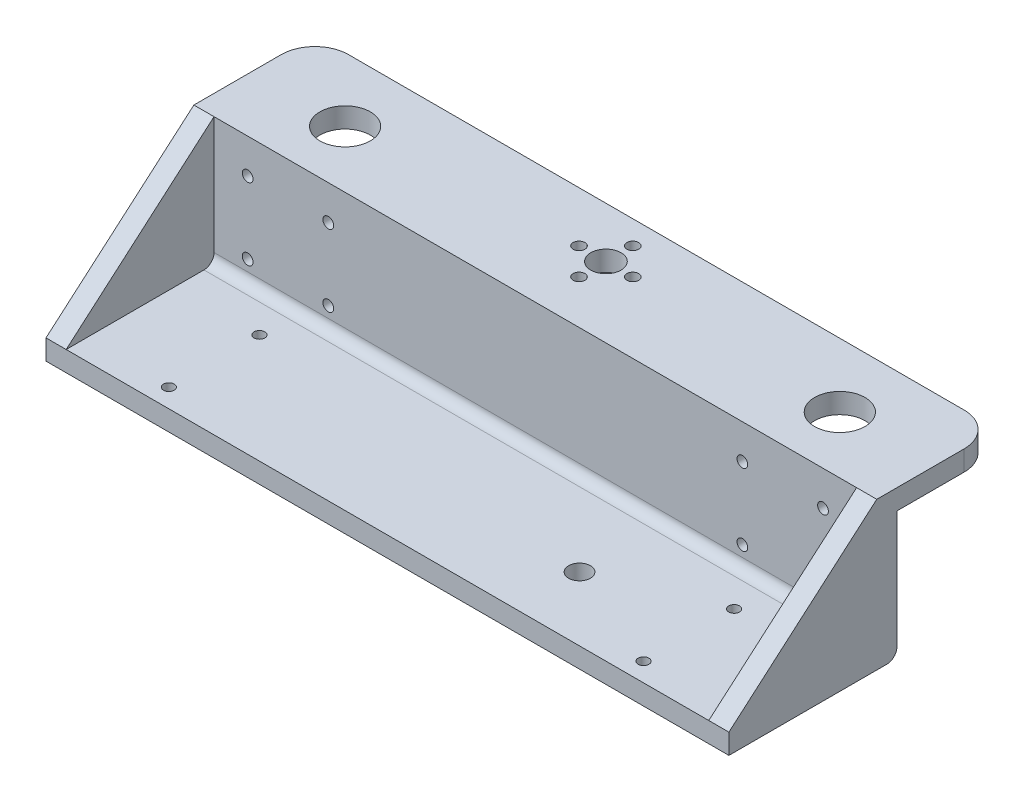
ISO-10303-21;
HEADER;
FILE_DESCRIPTION(('STEP AP214'),'2;1');
FILE_NAME('part.step','',(''),(''),'','','');
FILE_SCHEMA(('AUTOMOTIVE_DESIGN { 1 0 10303 214 1 1 1 1 }'));
ENDSEC;
DATA;
#1=APPLICATION_CONTEXT('core data for automotive mechanical design processes');
#2=APPLICATION_PROTOCOL_DEFINITION('international standard','automotive_design',2000,#1);
#3=PRODUCT_CONTEXT('',#1,'mechanical');
#4=PRODUCT('Part','Part','',(#3));
#5=PRODUCT_RELATED_PRODUCT_CATEGORY('part','',(#4));
#6=PRODUCT_DEFINITION_FORMATION('','',#4);
#7=PRODUCT_DEFINITION_CONTEXT('part definition',#1,'design');
#8=PRODUCT_DEFINITION('design','',#6,#7);
#9=PRODUCT_DEFINITION_SHAPE('','',#8);
#10=(LENGTH_UNIT() NAMED_UNIT(*) SI_UNIT(.MILLI.,.METRE.));
#11=(NAMED_UNIT(*) PLANE_ANGLE_UNIT() SI_UNIT($,.RADIAN.));
#12=(NAMED_UNIT(*) SI_UNIT($,.STERADIAN.) SOLID_ANGLE_UNIT());
#13=UNCERTAINTY_MEASURE_WITH_UNIT(LENGTH_MEASURE(1.E-05),#10,'distance_accuracy_value','');
#14=(GEOMETRIC_REPRESENTATION_CONTEXT(3) GLOBAL_UNCERTAINTY_ASSIGNED_CONTEXT((#13)) GLOBAL_UNIT_ASSIGNED_CONTEXT((#10,
#11,#12)) REPRESENTATION_CONTEXT('',''));
#15=CARTESIAN_POINT('',(0.,0.,0.));
#16=DIRECTION('',(0.,0.,1.));
#17=DIRECTION('',(1.,0.,0.));
#18=AXIS2_PLACEMENT_3D('',#15,#16,#17);
#19=CARTESIAN_POINT('',(0.,0.,6.));
#20=DIRECTION('',(0.,0.,-1.));
#21=DIRECTION('',(-1.,0.,0.));
#22=AXIS2_PLACEMENT_3D('',#19,#20,#21);
#23=PLANE('',#22);
#24=CARTESIAN_POINT('',(85.6,11.7,6.00000000000001));
#25=DIRECTION('',(0.,0.,-1.));
#26=DIRECTION('',(-1.,0.,0.));
#27=AXIS2_PLACEMENT_3D('',#24,#25,#26);
#28=CIRCLE('',#27,1.59999999999999);
#29=CARTESIAN_POINT('',(84.,11.7,6.00000000000001));
#30=VERTEX_POINT('',#29);
#31=EDGE_CURVE('E789',#30,#30,#28,.T.);
#32=ORIENTED_EDGE('',*,*,#31,.T.);
#33=EDGE_LOOP('',(#32));
#34=FACE_BOUND('',#33,.T.);
#35=CARTESIAN_POINT('',(61.6,11.7,6.00000000000001));
#36=DIRECTION('',(0.,0.,-1.));
#37=DIRECTION('',(-1.,0.,0.));
#38=AXIS2_PLACEMENT_3D('',#35,#36,#37);
#39=CIRCLE('',#38,1.59999999999999);
#40=CARTESIAN_POINT('',(60.,11.7,6.00000000000001));
#41=VERTEX_POINT('',#40);
#42=EDGE_CURVE('E783',#41,#41,#39,.T.);
#43=ORIENTED_EDGE('',*,*,#42,.T.);
#44=EDGE_LOOP('',(#43));
#45=FACE_BOUND('',#44,.T.);
#46=CARTESIAN_POINT('',(85.6,-9.7,6.00000000000001));
#47=DIRECTION('',(0.,0.,-1.));
#48=DIRECTION('',(-1.,0.,0.));
#49=AXIS2_PLACEMENT_3D('',#46,#47,#48);
#50=CIRCLE('',#49,1.59999999999999);
#51=CARTESIAN_POINT('',(84.,-9.7,6.00000000000001));
#52=VERTEX_POINT('',#51);
#53=EDGE_CURVE('E777',#52,#52,#50,.T.);
#54=ORIENTED_EDGE('',*,*,#53,.T.);
#55=EDGE_LOOP('',(#54));
#56=FACE_BOUND('',#55,.T.);
#57=CARTESIAN_POINT('',(61.6,-9.7,6.00000000000001));
#58=DIRECTION('',(0.,0.,-1.));
#59=DIRECTION('',(-1.,0.,0.));
#60=AXIS2_PLACEMENT_3D('',#57,#58,#59);
#61=CIRCLE('',#60,1.59999999999999);
#62=CARTESIAN_POINT('',(60.,-9.7,6.00000000000001));
#63=VERTEX_POINT('',#62);
#64=EDGE_CURVE('E771',#63,#63,#61,.T.);
#65=ORIENTED_EDGE('',*,*,#64,.T.);
#66=EDGE_LOOP('',(#65));
#67=FACE_BOUND('',#66,.T.);
#68=CARTESIAN_POINT('',(-61.6,11.7,6.00000000000001));
#69=DIRECTION('',(0.,0.,-1.));
#70=DIRECTION('',(-1.,0.,0.));
#71=AXIS2_PLACEMENT_3D('',#68,#69,#70);
#72=CIRCLE('',#71,1.59999999999999);
#73=CARTESIAN_POINT('',(-63.2,11.7,6.00000000000001));
#74=VERTEX_POINT('',#73);
#75=EDGE_CURVE('E765',#74,#74,#72,.T.);
#76=ORIENTED_EDGE('',*,*,#75,.T.);
#77=EDGE_LOOP('',(#76));
#78=FACE_BOUND('',#77,.T.);
#79=CARTESIAN_POINT('',(-85.6,11.7,6.00000000000001));
#80=DIRECTION('',(0.,0.,-1.));
#81=DIRECTION('',(-1.,0.,0.));
#82=AXIS2_PLACEMENT_3D('',#79,#80,#81);
#83=CIRCLE('',#82,1.59999999999999);
#84=CARTESIAN_POINT('',(-87.2,11.7,6.00000000000001));
#85=VERTEX_POINT('',#84);
#86=EDGE_CURVE('E745',#85,#85,#83,.T.);
#87=ORIENTED_EDGE('',*,*,#86,.T.);
#88=EDGE_LOOP('',(#87));
#89=FACE_BOUND('',#88,.T.);
#90=CARTESIAN_POINT('',(-61.6,-9.69999999999998,6.00000000000001));
#91=DIRECTION('',(0.,0.,-1.));
#92=DIRECTION('',(-1.,0.,0.));
#93=AXIS2_PLACEMENT_3D('',#90,#91,#92);
#94=CIRCLE('',#93,1.59999999999999);
#95=CARTESIAN_POINT('',(-63.2,-9.69999999999998,6.00000000000001));
#96=VERTEX_POINT('',#95);
#97=EDGE_CURVE('E740',#96,#96,#94,.T.);
#98=ORIENTED_EDGE('',*,*,#97,.T.);
#99=EDGE_LOOP('',(#98));
#100=FACE_BOUND('',#99,.T.);
#101=CARTESIAN_POINT('',(-85.6,-9.69999999999998,6.00000000000001));
#102=DIRECTION('',(0.,0.,-1.));
#103=DIRECTION('',(-1.,0.,0.));
#104=AXIS2_PLACEMENT_3D('',#101,#102,#103);
#105=CIRCLE('',#104,1.59999999999999);
#106=CARTESIAN_POINT('',(-87.2,-9.69999999999998,6.00000000000001));
#107=VERTEX_POINT('',#106);
#108=EDGE_CURVE('E756',#107,#107,#105,.T.);
#109=ORIENTED_EDGE('',*,*,#108,.T.);
#110=EDGE_LOOP('',(#109));
#111=FACE_BOUND('',#110,.T.);
#112=DIRECTION('',(0.,1.,0.));
#113=VECTOR('',#112,1.);
#114=CARTESIAN_POINT('',(-95.6,0.,6.));
#115=LINE('',#114,#113);
#116=CARTESIAN_POINT('',(-95.6,-13.,6.));
#117=VERTEX_POINT('',#116);
#118=CARTESIAN_POINT('',(-95.6,22.,6.));
#119=VERTEX_POINT('',#118);
#120=EDGE_CURVE('E145',#117,#119,#115,.T.);
#121=ORIENTED_EDGE('',*,*,#120,.F.);
#122=DIRECTION('',(1.,0.,0.));
#123=VECTOR('',#122,1.);
#124=CARTESIAN_POINT('',(95.6,-13.,6.));
#125=LINE('',#124,#123);
#126=CARTESIAN_POINT('',(95.6,-13.,6.));
#127=VERTEX_POINT('',#126);
#128=EDGE_CURVE('E263',#117,#127,#125,.T.);
#129=ORIENTED_EDGE('',*,*,#128,.T.);
#130=DIRECTION('',(0.,-1.,0.));
#131=VECTOR('',#130,1.);
#132=CARTESIAN_POINT('',(95.6,0.,6.));
#133=LINE('',#132,#131);
#134=CARTESIAN_POINT('',(95.6,22.,6.));
#135=VERTEX_POINT('',#134);
#136=EDGE_CURVE('E173',#135,#127,#133,.T.);
#137=ORIENTED_EDGE('',*,*,#136,.F.);
#138=DIRECTION('',(1.,0.,0.));
#139=VECTOR('',#138,1.);
#140=CARTESIAN_POINT('',(101.6,22.,6.));
#141=LINE('',#140,#139);
#142=EDGE_CURVE('E237',#119,#135,#141,.T.);
#143=ORIENTED_EDGE('',*,*,#142,.F.);
#144=EDGE_LOOP('',(#121,#129,#137,#143));
#145=FACE_BOUND('',#144,.T.);
#146=ADVANCED_FACE('F34',(#34,#45,#56,#67,#78,#89,#100,#111,#145),#23,.F.);
#147=CARTESIAN_POINT('',(0.,-16.,0.));
#148=DIRECTION('',(0.,-1.,0.));
#149=DIRECTION('',(0.,0.,-1.));
#150=AXIS2_PLACEMENT_3D('',#147,#148,#149);
#151=PLANE('',#150);
#152=CARTESIAN_POINT('',(-70.62,-16.,17.48));
#153=DIRECTION('',(0.,1.,0.));
#154=DIRECTION('',(0.,0.,1.));
#155=AXIS2_PLACEMENT_3D('',#152,#153,#154);
#156=CIRCLE('',#155,1.6);
#157=CARTESIAN_POINT('',(-70.62,-16.,19.08));
#158=VERTEX_POINT('',#157);
#159=EDGE_CURVE('E821',#158,#158,#156,.T.);
#160=ORIENTED_EDGE('',*,*,#159,.F.);
#161=EDGE_LOOP('',(#160));
#162=FACE_BOUND('',#161,.T.);
#163=CARTESIAN_POINT('',(-70.62,-16.,44.42));
#164=DIRECTION('',(0.,1.,0.));
#165=DIRECTION('',(0.,0.,1.));
#166=AXIS2_PLACEMENT_3D('',#163,#164,#165);
#167=CIRCLE('',#166,1.6);
#168=CARTESIAN_POINT('',(-70.62,-16.,46.02));
#169=VERTEX_POINT('',#168);
#170=EDGE_CURVE('E815',#169,#169,#167,.T.);
#171=ORIENTED_EDGE('',*,*,#170,.F.);
#172=EDGE_LOOP('',(#171));
#173=FACE_BOUND('',#172,.T.);
#174=CARTESIAN_POINT('',(70.62,-16.,17.48));
#175=DIRECTION('',(0.,1.,0.));
#176=DIRECTION('',(0.,0.,1.));
#177=AXIS2_PLACEMENT_3D('',#174,#175,#176);
#178=CIRCLE('',#177,1.6);
#179=CARTESIAN_POINT('',(70.62,-16.,19.08));
#180=VERTEX_POINT('',#179);
#181=EDGE_CURVE('E809',#180,#180,#178,.T.);
#182=ORIENTED_EDGE('',*,*,#181,.F.);
#183=EDGE_LOOP('',(#182));
#184=FACE_BOUND('',#183,.T.);
#185=CARTESIAN_POINT('',(70.62,-16.,44.42));
#186=DIRECTION('',(0.,1.,0.));
#187=DIRECTION('',(0.,0.,1.));
#188=AXIS2_PLACEMENT_3D('',#185,#186,#187);
#189=CIRCLE('',#188,1.6);
#190=CARTESIAN_POINT('',(70.62,-16.,46.02));
#191=VERTEX_POINT('',#190);
#192=EDGE_CURVE('E803',#191,#191,#189,.T.);
#193=ORIENTED_EDGE('',*,*,#192,.F.);
#194=EDGE_LOOP('',(#193));
#195=FACE_BOUND('',#194,.T.);
#196=CARTESIAN_POINT('',(38.1,-16.,30.95));
#197=DIRECTION('',(0.,-1.,0.));
#198=DIRECTION('',(0.,0.,-1.));
#199=AXIS2_PLACEMENT_3D('',#196,#197,#198);
#200=CIRCLE('',#199,3.2385);
#201=CARTESIAN_POINT('',(38.1,-16.,27.7115));
#202=VERTEX_POINT('',#201);
#203=EDGE_CURVE('E794',#202,#202,#200,.T.);
#204=ORIENTED_EDGE('',*,*,#203,.T.);
#205=EDGE_LOOP('',(#204));
#206=FACE_BOUND('',#205,.T.);
#207=DIRECTION('',(0.,0.,-1.));
#208=VECTOR('',#207,1.);
#209=CARTESIAN_POINT('',(95.6,-16.,0.));
#210=LINE('',#209,#208);
#211=CARTESIAN_POINT('',(95.6,-16.,50.));
#212=VERTEX_POINT('',#211);
#213=CARTESIAN_POINT('',(95.6,-16.,9.));
#214=VERTEX_POINT('',#213);
#215=EDGE_CURVE('E353',#212,#214,#210,.T.);
#216=ORIENTED_EDGE('',*,*,#215,.T.);
#217=DIRECTION('',(1.,0.,0.));
#218=VECTOR('',#217,1.);
#219=CARTESIAN_POINT('',(-95.6,-16.,9.));
#220=LINE('',#219,#218);
#221=CARTESIAN_POINT('',(-95.6,-16.,9.));
#222=VERTEX_POINT('',#221);
#223=EDGE_CURVE('E167',#214,#222,#220,.F.);
#224=ORIENTED_EDGE('',*,*,#223,.T.);
#225=DIRECTION('',(0.,0.,-1.));
#226=VECTOR('',#225,1.);
#227=CARTESIAN_POINT('',(-95.6,-16.,0.));
#228=LINE('',#227,#226);
#229=CARTESIAN_POINT('',(-95.6,-16.,50.));
#230=VERTEX_POINT('',#229);
#231=EDGE_CURVE('E142',#230,#222,#228,.T.);
#232=ORIENTED_EDGE('',*,*,#231,.F.);
#233=DIRECTION('',(-1.,0.,0.));
#234=VECTOR('',#233,1.);
#235=CARTESIAN_POINT('',(101.6,-16.,50.));
#236=LINE('',#235,#234);
#237=EDGE_CURVE('E164',#212,#230,#236,.T.);
#238=ORIENTED_EDGE('',*,*,#237,.F.);
#239=EDGE_LOOP('',(#216,#224,#232,#238));
#240=FACE_BOUND('',#239,.T.);
#241=ADVANCED_FACE('F163',(#162,#173,#184,#195,#206,#240),#151,.F.);
#242=CARTESIAN_POINT('',(101.6,-16.,6.));
#243=DIRECTION('',(-1.,0.,0.));
#244=DIRECTION('',(0.,0.,1.));
#245=AXIS2_PLACEMENT_3D('',#242,#243,#244);
#246=PLANE('',#245);
#247=DIRECTION('',(0.,0.,-1.));
#248=VECTOR('',#247,1.);
#249=CARTESIAN_POINT('',(101.6,16.,6.));
#250=LINE('',#249,#248);
#251=CARTESIAN_POINT('',(101.6,16.,0.));
#252=VERTEX_POINT('',#251);
#253=CARTESIAN_POINT('',(101.6,16.,-20.));
#254=VERTEX_POINT('',#253);
#255=EDGE_CURVE('E229',#252,#254,#250,.T.);
#256=ORIENTED_EDGE('',*,*,#255,.T.);
#257=DIRECTION('',(0.,-1.,0.));
#258=VECTOR('',#257,1.);
#259=CARTESIAN_POINT('',(101.6,-16.,-20.));
#260=LINE('',#259,#258);
#261=CARTESIAN_POINT('',(101.6,22.,-20.));
#262=VERTEX_POINT('',#261);
#263=EDGE_CURVE('E57',#254,#262,#260,.F.);
#264=ORIENTED_EDGE('',*,*,#263,.T.);
#265=DIRECTION('',(0.,0.,-1.));
#266=VECTOR('',#265,1.);
#267=CARTESIAN_POINT('',(101.6,22.,6.));
#268=LINE('',#267,#266);
#269=CARTESIAN_POINT('',(101.6,22.,6.));
#270=VERTEX_POINT('',#269);
#271=EDGE_CURVE('E230',#270,#262,#268,.T.);
#272=ORIENTED_EDGE('',*,*,#271,.F.);
#273=DIRECTION('',(0.,-0.653619870346092,0.75682300776916));
#274=VECTOR('',#273,1.);
#275=CARTESIAN_POINT('',(101.6,-16.,50.));
#276=LINE('',#275,#274);
#277=CARTESIAN_POINT('',(101.6,-16.,50.));
#278=VERTEX_POINT('',#277);
#279=EDGE_CURVE('E351',#270,#278,#276,.T.);
#280=ORIENTED_EDGE('',*,*,#279,.T.);
#281=DIRECTION('',(0.,1.,0.));
#282=VECTOR('',#281,1.);
#283=CARTESIAN_POINT('',(101.6,-22.,50.));
#284=LINE('',#283,#282);
#285=CARTESIAN_POINT('',(101.6,-22.,50.));
#286=VERTEX_POINT('',#285);
#287=EDGE_CURVE('E185',#286,#278,#284,.T.);
#288=ORIENTED_EDGE('',*,*,#287,.F.);
#289=DIRECTION('',(0.,0.,1.));
#290=VECTOR('',#289,1.);
#291=CARTESIAN_POINT('',(101.6,-22.,0.));
#292=LINE('',#291,#290);
#293=CARTESIAN_POINT('',(101.6,-22.,3.));
#294=VERTEX_POINT('',#293);
#295=EDGE_CURVE('E175',#294,#286,#292,.T.);
#296=ORIENTED_EDGE('',*,*,#295,.F.);
#297=CARTESIAN_POINT('',(101.6,-19.,3.));
#298=DIRECTION('',(-1.,0.,0.));
#299=DIRECTION('',(0.,0.,1.));
#300=AXIS2_PLACEMENT_3D('',#297,#298,#299);
#301=CIRCLE('',#300,3.);
#302=CARTESIAN_POINT('',(101.6,-19.,0.));
#303=VERTEX_POINT('',#302);
#304=EDGE_CURVE('E257',#294,#303,#301,.F.);
#305=ORIENTED_EDGE('',*,*,#304,.T.);
#306=DIRECTION('',(0.,1.,0.));
#307=VECTOR('',#306,1.);
#308=CARTESIAN_POINT('',(101.6,-16.,0.));
#309=LINE('',#308,#307);
#310=EDGE_CURVE('E241',#303,#252,#309,.T.);
#311=ORIENTED_EDGE('',*,*,#310,.T.);
#312=EDGE_LOOP('',(#256,#264,#272,#280,#288,#296,#305,#311));
#313=FACE_BOUND('',#312,.T.);
#314=ADVANCED_FACE('F296',(#313),#246,.F.);
#315=CARTESIAN_POINT('',(-101.6,-16.,6.));
#316=DIRECTION('',(1.,0.,0.));
#317=DIRECTION('',(0.,0.,-1.));
#318=AXIS2_PLACEMENT_3D('',#315,#316,#317);
#319=PLANE('',#318);
#320=DIRECTION('',(0.,0.,1.));
#321=VECTOR('',#320,1.);
#322=CARTESIAN_POINT('',(-101.6,22.,6.));
#323=LINE('',#322,#321);
#324=CARTESIAN_POINT('',(-101.6,22.,-20.));
#325=VERTEX_POINT('',#324);
#326=CARTESIAN_POINT('',(-101.6,22.,6.));
#327=VERTEX_POINT('',#326);
#328=EDGE_CURVE('E235',#325,#327,#323,.T.);
#329=ORIENTED_EDGE('',*,*,#328,.F.);
#330=DIRECTION('',(0.,-1.,0.));
#331=VECTOR('',#330,1.);
#332=CARTESIAN_POINT('',(-101.6,-16.,-20.));
#333=LINE('',#332,#331);
#334=CARTESIAN_POINT('',(-101.6,16.,-20.));
#335=VERTEX_POINT('',#334);
#336=EDGE_CURVE('E11',#325,#335,#333,.T.);
#337=ORIENTED_EDGE('',*,*,#336,.T.);
#338=DIRECTION('',(0.,0.,1.));
#339=VECTOR('',#338,1.);
#340=CARTESIAN_POINT('',(-101.6,16.,6.));
#341=LINE('',#340,#339);
#342=CARTESIAN_POINT('',(-101.6,16.,0.));
#343=VERTEX_POINT('',#342);
#344=EDGE_CURVE('E233',#335,#343,#341,.T.);
#345=ORIENTED_EDGE('',*,*,#344,.T.);
#346=DIRECTION('',(0.,-1.,0.));
#347=VECTOR('',#346,1.);
#348=CARTESIAN_POINT('',(-101.6,-16.,0.));
#349=LINE('',#348,#347);
#350=CARTESIAN_POINT('',(-101.6,-19.,0.));
#351=VERTEX_POINT('',#350);
#352=EDGE_CURVE('E251',#343,#351,#349,.T.);
#353=ORIENTED_EDGE('',*,*,#352,.T.);
#354=CARTESIAN_POINT('',(-101.6,-19.,3.));
#355=DIRECTION('',(1.,0.,0.));
#356=DIRECTION('',(0.,0.,-1.));
#357=AXIS2_PLACEMENT_3D('',#354,#355,#356);
#358=CIRCLE('',#357,3.);
#359=CARTESIAN_POINT('',(-101.6,-22.,3.));
#360=VERTEX_POINT('',#359);
#361=EDGE_CURVE('E261',#351,#360,#358,.F.);
#362=ORIENTED_EDGE('',*,*,#361,.T.);
#363=DIRECTION('',(0.,0.,-1.));
#364=VECTOR('',#363,1.);
#365=CARTESIAN_POINT('',(-101.6,-22.,0.));
#366=LINE('',#365,#364);
#367=CARTESIAN_POINT('',(-101.6,-22.,50.));
#368=VERTEX_POINT('',#367);
#369=EDGE_CURVE('E181',#368,#360,#366,.T.);
#370=ORIENTED_EDGE('',*,*,#369,.F.);
#371=DIRECTION('',(0.,1.,0.));
#372=VECTOR('',#371,1.);
#373=CARTESIAN_POINT('',(-101.6,-22.,50.));
#374=LINE('',#373,#372);
#375=CARTESIAN_POINT('',(-101.6,-16.,50.));
#376=VERTEX_POINT('',#375);
#377=EDGE_CURVE('E183',#368,#376,#374,.T.);
#378=ORIENTED_EDGE('',*,*,#377,.T.);
#379=DIRECTION('',(0.,-0.653619870346092,0.75682300776916));
#380=VECTOR('',#379,1.);
#381=CARTESIAN_POINT('',(-101.6,-16.,50.));
#382=LINE('',#381,#380);
#383=EDGE_CURVE('E154',#327,#376,#382,.T.);
#384=ORIENTED_EDGE('',*,*,#383,.F.);
#385=EDGE_LOOP('',(#329,#337,#345,#353,#362,#370,#378,#384));
#386=FACE_BOUND('',#385,.T.);
#387=ADVANCED_FACE('F306',(#386),#319,.F.);
#388=CARTESIAN_POINT('',(0.,0.,0.));
#389=DIRECTION('',(0.,0.,-1.));
#390=DIRECTION('',(-1.,0.,0.));
#391=AXIS2_PLACEMENT_3D('',#388,#389,#390);
#392=PLANE('',#391);
#393=CARTESIAN_POINT('',(85.6,11.7,0.));
#394=DIRECTION('',(0.,0.,-1.));
#395=DIRECTION('',(-1.,0.,0.));
#396=AXIS2_PLACEMENT_3D('',#393,#394,#395);
#397=CIRCLE('',#396,1.59999999999999);
#398=CARTESIAN_POINT('',(84.,11.7,0.));
#399=VERTEX_POINT('',#398);
#400=EDGE_CURVE('E791',#399,#399,#397,.T.);
#401=ORIENTED_EDGE('',*,*,#400,.F.);
#402=EDGE_LOOP('',(#401));
#403=FACE_BOUND('',#402,.T.);
#404=CARTESIAN_POINT('',(61.6,11.7,0.));
#405=DIRECTION('',(0.,0.,-1.));
#406=DIRECTION('',(-1.,0.,0.));
#407=AXIS2_PLACEMENT_3D('',#404,#405,#406);
#408=CIRCLE('',#407,1.59999999999999);
#409=CARTESIAN_POINT('',(60.,11.7,0.));
#410=VERTEX_POINT('',#409);
#411=EDGE_CURVE('E786',#410,#410,#408,.T.);
#412=ORIENTED_EDGE('',*,*,#411,.F.);
#413=EDGE_LOOP('',(#412));
#414=FACE_BOUND('',#413,.T.);
#415=CARTESIAN_POINT('',(85.6,-9.7,0.));
#416=DIRECTION('',(0.,0.,-1.));
#417=DIRECTION('',(-1.,0.,0.));
#418=AXIS2_PLACEMENT_3D('',#415,#416,#417);
#419=CIRCLE('',#418,1.59999999999999);
#420=CARTESIAN_POINT('',(84.,-9.7,0.));
#421=VERTEX_POINT('',#420);
#422=EDGE_CURVE('E780',#421,#421,#419,.T.);
#423=ORIENTED_EDGE('',*,*,#422,.F.);
#424=EDGE_LOOP('',(#423));
#425=FACE_BOUND('',#424,.T.);
#426=CARTESIAN_POINT('',(61.6,-9.7,0.));
#427=DIRECTION('',(0.,0.,-1.));
#428=DIRECTION('',(-1.,0.,0.));
#429=AXIS2_PLACEMENT_3D('',#426,#427,#428);
#430=CIRCLE('',#429,1.59999999999999);
#431=CARTESIAN_POINT('',(60.,-9.7,0.));
#432=VERTEX_POINT('',#431);
#433=EDGE_CURVE('E774',#432,#432,#430,.T.);
#434=ORIENTED_EDGE('',*,*,#433,.F.);
#435=EDGE_LOOP('',(#434));
#436=FACE_BOUND('',#435,.T.);
#437=CARTESIAN_POINT('',(-61.6,11.7,0.));
#438=DIRECTION('',(0.,0.,-1.));
#439=DIRECTION('',(-1.,0.,0.));
#440=AXIS2_PLACEMENT_3D('',#437,#438,#439);
#441=CIRCLE('',#440,1.59999999999999);
#442=CARTESIAN_POINT('',(-63.2,11.7,0.));
#443=VERTEX_POINT('',#442);
#444=EDGE_CURVE('E768',#443,#443,#441,.T.);
#445=ORIENTED_EDGE('',*,*,#444,.F.);
#446=EDGE_LOOP('',(#445));
#447=FACE_BOUND('',#446,.T.);
#448=CARTESIAN_POINT('',(-85.6,11.7,0.));
#449=DIRECTION('',(0.,0.,-1.));
#450=DIRECTION('',(-1.,0.,0.));
#451=AXIS2_PLACEMENT_3D('',#448,#449,#450);
#452=CIRCLE('',#451,1.59999999999999);
#453=CARTESIAN_POINT('',(-87.2,11.7,0.));
#454=VERTEX_POINT('',#453);
#455=EDGE_CURVE('E750',#454,#454,#452,.T.);
#456=ORIENTED_EDGE('',*,*,#455,.F.);
#457=EDGE_LOOP('',(#456));
#458=FACE_BOUND('',#457,.T.);
#459=CARTESIAN_POINT('',(-61.6,-9.69999999999998,0.));
#460=DIRECTION('',(0.,0.,-1.));
#461=DIRECTION('',(-1.,0.,0.));
#462=AXIS2_PLACEMENT_3D('',#459,#460,#461);
#463=CIRCLE('',#462,1.59999999999999);
#464=CARTESIAN_POINT('',(-63.2,-9.69999999999998,0.));
#465=VERTEX_POINT('',#464);
#466=EDGE_CURVE('E743',#465,#465,#463,.T.);
#467=ORIENTED_EDGE('',*,*,#466,.F.);
#468=EDGE_LOOP('',(#467));
#469=FACE_BOUND('',#468,.T.);
#470=CARTESIAN_POINT('',(-85.6,-9.69999999999998,0.));
#471=DIRECTION('',(0.,0.,-1.));
#472=DIRECTION('',(-1.,0.,0.));
#473=AXIS2_PLACEMENT_3D('',#470,#471,#472);
#474=CIRCLE('',#473,1.59999999999999);
#475=CARTESIAN_POINT('',(-87.2,-9.69999999999998,0.));
#476=VERTEX_POINT('',#475);
#477=EDGE_CURVE('E747',#476,#476,#474,.T.);
#478=ORIENTED_EDGE('',*,*,#477,.F.);
#479=EDGE_LOOP('',(#478));
#480=FACE_BOUND('',#479,.T.);
#481=ORIENTED_EDGE('',*,*,#310,.F.);
#482=DIRECTION('',(1.,0.,0.));
#483=VECTOR('',#482,1.);
#484=CARTESIAN_POINT('',(0.,-19.,0.));
#485=LINE('',#484,#483);
#486=EDGE_CURVE('E259',#303,#351,#485,.F.);
#487=ORIENTED_EDGE('',*,*,#486,.T.);
#488=ORIENTED_EDGE('',*,*,#352,.F.);
#489=DIRECTION('',(-1.,0.,0.));
#490=VECTOR('',#489,1.);
#491=CARTESIAN_POINT('',(-101.6,16.,0.));
#492=LINE('',#491,#490);
#493=EDGE_CURVE('E248',#252,#343,#492,.T.);
#494=ORIENTED_EDGE('',*,*,#493,.F.);
#495=EDGE_LOOP('',(#481,#487,#488,#494));
#496=FACE_BOUND('',#495,.T.);
#497=ADVANCED_FACE('F303',(#403,#414,#425,#436,#447,#458,#469,#480,#496),#392,.T.);
#498=CARTESIAN_POINT('',(0.,16.,0.));
#499=DIRECTION('',(0.,1.,0.));
#500=DIRECTION('',(0.,0.,1.));
#501=AXIS2_PLACEMENT_3D('',#498,#499,#500);
#502=PLANE('',#501);
#503=CARTESIAN_POINT('',(-73.6,16.,-11.));
#504=DIRECTION('',(0.,1.,0.));
#505=DIRECTION('',(0.,0.,1.));
#506=AXIS2_PLACEMENT_3D('',#503,#504,#505);
#507=CIRCLE('',#506,7.5);
#508=CARTESIAN_POINT('',(-73.6,16.,-3.5));
#509=VERTEX_POINT('',#508);
#510=EDGE_CURVE('E226',#509,#509,#507,.T.);
#511=ORIENTED_EDGE('',*,*,#510,.T.);
#512=EDGE_LOOP('',(#511));
#513=FACE_BOUND('',#512,.T.);
#514=CARTESIAN_POINT('',(-8.,16.,-15.));
#515=DIRECTION('',(0.,1.,0.));
#516=DIRECTION('',(0.,0.,1.));
#517=AXIS2_PLACEMENT_3D('',#514,#515,#516);
#518=CIRCLE('',#517,1.75);
#519=CARTESIAN_POINT('',(-8.,16.,-13.25));
#520=VERTEX_POINT('',#519);
#521=EDGE_CURVE('E223',#520,#520,#518,.T.);
#522=ORIENTED_EDGE('',*,*,#521,.T.);
#523=EDGE_LOOP('',(#522));
#524=FACE_BOUND('',#523,.T.);
#525=CARTESIAN_POINT('',(8.,16.,-15.));
#526=DIRECTION('',(0.,1.,0.));
#527=DIRECTION('',(0.,0.,1.));
#528=AXIS2_PLACEMENT_3D('',#525,#526,#527);
#529=CIRCLE('',#528,1.75);
#530=CARTESIAN_POINT('',(8.,16.,-13.25));
#531=VERTEX_POINT('',#530);
#532=EDGE_CURVE('E220',#531,#531,#529,.T.);
#533=ORIENTED_EDGE('',*,*,#532,.T.);
#534=EDGE_LOOP('',(#533));
#535=FACE_BOUND('',#534,.T.);
#536=CARTESIAN_POINT('',(73.6,16.,-11.));
#537=DIRECTION('',(0.,1.,0.));
#538=DIRECTION('',(0.,0.,1.));
#539=AXIS2_PLACEMENT_3D('',#536,#537,#538);
#540=CIRCLE('',#539,7.50000000000001);
#541=CARTESIAN_POINT('',(73.6,16.,-3.49999999999999));
#542=VERTEX_POINT('',#541);
#543=EDGE_CURVE('E217',#542,#542,#540,.T.);
#544=ORIENTED_EDGE('',*,*,#543,.T.);
#545=EDGE_LOOP('',(#544));
#546=FACE_BOUND('',#545,.T.);
#547=CARTESIAN_POINT('',(0.,16.,-15.));
#548=DIRECTION('',(0.,1.,0.));
#549=DIRECTION('',(0.,0.,1.));
#550=AXIS2_PLACEMENT_3D('',#547,#548,#549);
#551=CIRCLE('',#550,4.5);
#552=CARTESIAN_POINT('',(0.,16.,-10.5));
#553=VERTEX_POINT('',#552);
#554=EDGE_CURVE('E214',#553,#553,#551,.T.);
#555=ORIENTED_EDGE('',*,*,#554,.T.);
#556=EDGE_LOOP('',(#555));
#557=FACE_BOUND('',#556,.T.);
#558=CARTESIAN_POINT('',(0.,16.,-23.));
#559=DIRECTION('',(0.,1.,0.));
#560=DIRECTION('',(0.,0.,1.));
#561=AXIS2_PLACEMENT_3D('',#558,#559,#560);
#562=CIRCLE('',#561,1.75);
#563=CARTESIAN_POINT('',(0.,16.,-21.25));
#564=VERTEX_POINT('',#563);
#565=EDGE_CURVE('E211',#564,#564,#562,.T.);
#566=ORIENTED_EDGE('',*,*,#565,.T.);
#567=EDGE_LOOP('',(#566));
#568=FACE_BOUND('',#567,.T.);
#569=CARTESIAN_POINT('',(0.,16.,-7.));
#570=DIRECTION('',(0.,1.,0.));
#571=DIRECTION('',(0.,0.,1.));
#572=AXIS2_PLACEMENT_3D('',#569,#570,#571);
#573=CIRCLE('',#572,1.75);
#574=CARTESIAN_POINT('',(0.,16.,-5.25));
#575=VERTEX_POINT('',#574);
#576=EDGE_CURVE('E191',#575,#575,#573,.T.);
#577=ORIENTED_EDGE('',*,*,#576,.T.);
#578=EDGE_LOOP('',(#577));
#579=FACE_BOUND('',#578,.T.);
#580=DIRECTION('',(-1.,0.,0.));
#581=VECTOR('',#580,1.);
#582=CARTESIAN_POINT('',(101.6,16.,-30.));
#583=LINE('',#582,#581);
#584=CARTESIAN_POINT('',(91.6,16.,-30.));
#585=VERTEX_POINT('',#584);
#586=CARTESIAN_POINT('',(-91.6,16.,-30.));
#587=VERTEX_POINT('',#586);
#588=EDGE_CURVE('E243',#585,#587,#583,.T.);
#589=ORIENTED_EDGE('',*,*,#588,.F.);
#590=CARTESIAN_POINT('',(91.6,16.,-20.));
#591=DIRECTION('',(0.,1.,0.));
#592=DIRECTION('',(0.,0.,1.));
#593=AXIS2_PLACEMENT_3D('',#590,#591,#592);
#594=CIRCLE('',#593,10.);
#595=EDGE_CURVE('E278',#585,#254,#594,.F.);
#596=ORIENTED_EDGE('',*,*,#595,.T.);
#597=ORIENTED_EDGE('',*,*,#255,.F.);
#598=ORIENTED_EDGE('',*,*,#493,.T.);
#599=ORIENTED_EDGE('',*,*,#344,.F.);
#600=CARTESIAN_POINT('',(-91.6,16.,-20.));
#601=DIRECTION('',(0.,1.,0.));
#602=DIRECTION('',(0.,0.,1.));
#603=AXIS2_PLACEMENT_3D('',#600,#601,#602);
#604=CIRCLE('',#603,10.);
#605=EDGE_CURVE('E276',#335,#587,#604,.F.);
#606=ORIENTED_EDGE('',*,*,#605,.T.);
#607=EDGE_LOOP('',(#589,#596,#597,#598,#599,#606));
#608=FACE_BOUND('',#607,.T.);
#609=ADVANCED_FACE('F295',(#513,#524,#535,#546,#557,#568,#579,#608),#502,.F.);
#610=CARTESIAN_POINT('',(101.6,22.,-30.));
#611=DIRECTION('',(0.,0.,1.));
#612=DIRECTION('',(1.,0.,0.));
#613=AXIS2_PLACEMENT_3D('',#610,#611,#612);
#614=PLANE('',#613);
#615=DIRECTION('',(-1.,0.,0.));
#616=VECTOR('',#615,1.);
#617=CARTESIAN_POINT('',(101.6,22.,-30.));
#618=LINE('',#617,#616);
#619=CARTESIAN_POINT('',(91.6,22.,-30.));
#620=VERTEX_POINT('',#619);
#621=CARTESIAN_POINT('',(-91.6,22.,-30.));
#622=VERTEX_POINT('',#621);
#623=EDGE_CURVE('E232',#620,#622,#618,.T.);
#624=ORIENTED_EDGE('',*,*,#623,.F.);
#625=DIRECTION('',(0.,-1.,0.));
#626=VECTOR('',#625,1.);
#627=CARTESIAN_POINT('',(91.6,22.,-30.));
#628=LINE('',#627,#626);
#629=EDGE_CURVE('E273',#620,#585,#628,.T.);
#630=ORIENTED_EDGE('',*,*,#629,.T.);
#631=ORIENTED_EDGE('',*,*,#588,.T.);
#632=DIRECTION('',(0.,-1.,0.));
#633=VECTOR('',#632,1.);
#634=CARTESIAN_POINT('',(-91.6,22.,-30.));
#635=LINE('',#634,#633);
#636=EDGE_CURVE('E271',#587,#622,#635,.F.);
#637=ORIENTED_EDGE('',*,*,#636,.T.);
#638=EDGE_LOOP('',(#624,#630,#631,#637));
#639=FACE_BOUND('',#638,.T.);
#640=ADVANCED_FACE('F289',(#639),#614,.F.);
#641=CARTESIAN_POINT('',(0.,22.,0.));
#642=DIRECTION('',(0.,1.,0.));
#643=DIRECTION('',(0.,0.,1.));
#644=AXIS2_PLACEMENT_3D('',#641,#642,#643);
#645=PLANE('',#644);
#646=ORIENTED_EDGE('',*,*,#271,.T.);
#647=CARTESIAN_POINT('',(91.6,22.,-20.));
#648=DIRECTION('',(0.,1.,0.));
#649=DIRECTION('',(0.,0.,1.));
#650=AXIS2_PLACEMENT_3D('',#647,#648,#649);
#651=CIRCLE('',#650,10.);
#652=EDGE_CURVE('E42',#262,#620,#651,.T.);
#653=ORIENTED_EDGE('',*,*,#652,.T.);
#654=ORIENTED_EDGE('',*,*,#623,.T.);
#655=CARTESIAN_POINT('',(-91.6,22.,-20.));
#656=DIRECTION('',(0.,1.,0.));
#657=DIRECTION('',(0.,0.,1.));
#658=AXIS2_PLACEMENT_3D('',#655,#656,#657);
#659=CIRCLE('',#658,10.);
#660=EDGE_CURVE('E49',#622,#325,#659,.T.);
#661=ORIENTED_EDGE('',*,*,#660,.T.);
#662=ORIENTED_EDGE('',*,*,#328,.T.);
#663=EDGE_CURVE('E238',#327,#119,#141,.T.);
#664=ORIENTED_EDGE('',*,*,#663,.T.);
#665=ORIENTED_EDGE('',*,*,#142,.T.);
#666=DIRECTION('',(1.,0.,0.));
#667=VECTOR('',#666,1.);
#668=CARTESIAN_POINT('',(95.6,22.,6.));
#669=LINE('',#668,#667);
#670=EDGE_CURVE('E177',#135,#270,#669,.T.);
#671=ORIENTED_EDGE('',*,*,#670,.T.);
#672=EDGE_LOOP('',(#646,#653,#654,#661,#662,#664,#665,#671));
#673=FACE_BOUND('',#672,.T.);
#674=CARTESIAN_POINT('',(-73.6,22.,-11.));
#675=DIRECTION('',(0.,1.,0.));
#676=DIRECTION('',(0.,0.,1.));
#677=AXIS2_PLACEMENT_3D('',#674,#675,#676);
#678=CIRCLE('',#677,7.5);
#679=CARTESIAN_POINT('',(-73.6,22.,-3.5));
#680=VERTEX_POINT('',#679);
#681=EDGE_CURVE('E188',#680,#680,#678,.T.);
#682=ORIENTED_EDGE('',*,*,#681,.F.);
#683=EDGE_LOOP('',(#682));
#684=FACE_BOUND('',#683,.T.);
#685=CARTESIAN_POINT('',(-8.,22.,-15.));
#686=DIRECTION('',(0.,1.,0.));
#687=DIRECTION('',(0.,0.,1.));
#688=AXIS2_PLACEMENT_3D('',#685,#686,#687);
#689=CIRCLE('',#688,1.75);
#690=CARTESIAN_POINT('',(-8.,22.,-13.25));
#691=VERTEX_POINT('',#690);
#692=EDGE_CURVE('E187',#691,#691,#689,.T.);
#693=ORIENTED_EDGE('',*,*,#692,.F.);
#694=EDGE_LOOP('',(#693));
#695=FACE_BOUND('',#694,.T.);
#696=CARTESIAN_POINT('',(8.,22.,-15.));
#697=DIRECTION('',(0.,1.,0.));
#698=DIRECTION('',(0.,0.,1.));
#699=AXIS2_PLACEMENT_3D('',#696,#697,#698);
#700=CIRCLE('',#699,1.75);
#701=CARTESIAN_POINT('',(8.,22.,-13.25));
#702=VERTEX_POINT('',#701);
#703=EDGE_CURVE('E193',#702,#702,#700,.T.);
#704=ORIENTED_EDGE('',*,*,#703,.F.);
#705=EDGE_LOOP('',(#704));
#706=FACE_BOUND('',#705,.T.);
#707=CARTESIAN_POINT('',(73.6,22.,-11.));
#708=DIRECTION('',(0.,1.,0.));
#709=DIRECTION('',(0.,0.,1.));
#710=AXIS2_PLACEMENT_3D('',#707,#708,#709);
#711=CIRCLE('',#710,7.50000000000001);
#712=CARTESIAN_POINT('',(73.6,22.,-3.49999999999999));
#713=VERTEX_POINT('',#712);
#714=EDGE_CURVE('E192',#713,#713,#711,.T.);
#715=ORIENTED_EDGE('',*,*,#714,.F.);
#716=EDGE_LOOP('',(#715));
#717=FACE_BOUND('',#716,.T.);
#718=CARTESIAN_POINT('',(0.,22.,-15.));
#719=DIRECTION('',(0.,1.,0.));
#720=DIRECTION('',(0.,0.,1.));
#721=AXIS2_PLACEMENT_3D('',#718,#719,#720);
#722=CIRCLE('',#721,4.5);
#723=CARTESIAN_POINT('',(0.,22.,-10.5));
#724=VERTEX_POINT('',#723);
#725=EDGE_CURVE('E202',#724,#724,#722,.T.);
#726=ORIENTED_EDGE('',*,*,#725,.F.);
#727=EDGE_LOOP('',(#726));
#728=FACE_BOUND('',#727,.T.);
#729=CARTESIAN_POINT('',(0.,22.,-23.));
#730=DIRECTION('',(0.,1.,0.));
#731=DIRECTION('',(0.,0.,1.));
#732=AXIS2_PLACEMENT_3D('',#729,#730,#731);
#733=CIRCLE('',#732,1.75);
#734=CARTESIAN_POINT('',(0.,22.,-21.25));
#735=VERTEX_POINT('',#734);
#736=EDGE_CURVE('E199',#735,#735,#733,.T.);
#737=ORIENTED_EDGE('',*,*,#736,.F.);
#738=EDGE_LOOP('',(#737));
#739=FACE_BOUND('',#738,.T.);
#740=CARTESIAN_POINT('',(0.,22.,-7.));
#741=DIRECTION('',(0.,1.,0.));
#742=DIRECTION('',(0.,0.,1.));
#743=AXIS2_PLACEMENT_3D('',#740,#741,#742);
#744=CIRCLE('',#743,1.75);
#745=CARTESIAN_POINT('',(0.,22.,-5.25));
#746=VERTEX_POINT('',#745);
#747=EDGE_CURVE('E196',#746,#746,#744,.T.);
#748=ORIENTED_EDGE('',*,*,#747,.F.);
#749=EDGE_LOOP('',(#748));
#750=FACE_BOUND('',#749,.T.);
#751=ADVANCED_FACE('F283',(#673,#684,#695,#706,#717,#728,#739,#750),#645,.T.);
#752=CARTESIAN_POINT('',(0.,-16.,-7.));
#753=DIRECTION('',(0.,1.,0.));
#754=DIRECTION('',(0.,0.,1.));
#755=AXIS2_PLACEMENT_3D('',#752,#753,#754);
#756=CYLINDRICAL_SURFACE('',#755,1.75);
#757=ORIENTED_EDGE('',*,*,#747,.T.);
#758=EDGE_LOOP('',(#757));
#759=FACE_BOUND('',#758,.T.);
#760=ORIENTED_EDGE('',*,*,#576,.F.);
#761=EDGE_LOOP('',(#760));
#762=FACE_BOUND('',#761,.T.);
#763=ADVANCED_FACE('F407',(#759,#762),#756,.F.);
#764=CARTESIAN_POINT('',(0.,-16.,-23.));
#765=DIRECTION('',(0.,1.,0.));
#766=DIRECTION('',(0.,0.,1.));
#767=AXIS2_PLACEMENT_3D('',#764,#765,#766);
#768=CYLINDRICAL_SURFACE('',#767,1.75);
#769=ORIENTED_EDGE('',*,*,#736,.T.);
#770=EDGE_LOOP('',(#769));
#771=FACE_BOUND('',#770,.T.);
#772=ORIENTED_EDGE('',*,*,#565,.F.);
#773=EDGE_LOOP('',(#772));
#774=FACE_BOUND('',#773,.T.);
#775=ADVANCED_FACE('F403',(#771,#774),#768,.F.);
#776=CARTESIAN_POINT('',(0.,-16.,-15.));
#777=DIRECTION('',(0.,1.,0.));
#778=DIRECTION('',(0.,0.,1.));
#779=AXIS2_PLACEMENT_3D('',#776,#777,#778);
#780=CYLINDRICAL_SURFACE('',#779,4.5);
#781=ORIENTED_EDGE('',*,*,#725,.T.);
#782=EDGE_LOOP('',(#781));
#783=FACE_BOUND('',#782,.T.);
#784=ORIENTED_EDGE('',*,*,#554,.F.);
#785=EDGE_LOOP('',(#784));
#786=FACE_BOUND('',#785,.T.);
#787=ADVANCED_FACE('F406',(#783,#786),#780,.F.);
#788=CARTESIAN_POINT('',(73.6,-16.,-11.));
#789=DIRECTION('',(0.,1.,0.));
#790=DIRECTION('',(0.,0.,1.));
#791=AXIS2_PLACEMENT_3D('',#788,#789,#790);
#792=CYLINDRICAL_SURFACE('',#791,7.50000000000001);
#793=ORIENTED_EDGE('',*,*,#714,.T.);
#794=EDGE_LOOP('',(#793));
#795=FACE_BOUND('',#794,.T.);
#796=ORIENTED_EDGE('',*,*,#543,.F.);
#797=EDGE_LOOP('',(#796));
#798=FACE_BOUND('',#797,.T.);
#799=ADVANCED_FACE('F398',(#795,#798),#792,.F.);
#800=CARTESIAN_POINT('',(8.,-16.,-15.));
#801=DIRECTION('',(0.,1.,0.));
#802=DIRECTION('',(0.,0.,1.));
#803=AXIS2_PLACEMENT_3D('',#800,#801,#802);
#804=CYLINDRICAL_SURFACE('',#803,1.75);
#805=ORIENTED_EDGE('',*,*,#703,.T.);
#806=EDGE_LOOP('',(#805));
#807=FACE_BOUND('',#806,.T.);
#808=ORIENTED_EDGE('',*,*,#532,.F.);
#809=EDGE_LOOP('',(#808));
#810=FACE_BOUND('',#809,.T.);
#811=ADVANCED_FACE('F395',(#807,#810),#804,.F.);
#812=CARTESIAN_POINT('',(-8.,-16.,-15.));
#813=DIRECTION('',(0.,1.,0.));
#814=DIRECTION('',(0.,0.,1.));
#815=AXIS2_PLACEMENT_3D('',#812,#813,#814);
#816=CYLINDRICAL_SURFACE('',#815,1.75);
#817=ORIENTED_EDGE('',*,*,#692,.T.);
#818=EDGE_LOOP('',(#817));
#819=FACE_BOUND('',#818,.T.);
#820=ORIENTED_EDGE('',*,*,#521,.F.);
#821=EDGE_LOOP('',(#820));
#822=FACE_BOUND('',#821,.T.);
#823=ADVANCED_FACE('F393',(#819,#822),#816,.F.);
#824=CARTESIAN_POINT('',(-73.6,-16.,-11.));
#825=DIRECTION('',(0.,1.,0.));
#826=DIRECTION('',(0.,0.,1.));
#827=AXIS2_PLACEMENT_3D('',#824,#825,#826);
#828=CYLINDRICAL_SURFACE('',#827,7.5);
#829=ORIENTED_EDGE('',*,*,#681,.T.);
#830=EDGE_LOOP('',(#829));
#831=FACE_BOUND('',#830,.T.);
#832=ORIENTED_EDGE('',*,*,#510,.F.);
#833=EDGE_LOOP('',(#832));
#834=FACE_BOUND('',#833,.T.);
#835=ADVANCED_FACE('F390',(#831,#834),#828,.F.);
#836=CARTESIAN_POINT('',(101.6,-22.,50.));
#837=DIRECTION('',(0.,0.,-1.));
#838=DIRECTION('',(-1.,0.,0.));
#839=AXIS2_PLACEMENT_3D('',#836,#837,#838);
#840=PLANE('',#839);
#841=EDGE_CURVE('E172',#278,#212,#236,.T.);
#842=ORIENTED_EDGE('',*,*,#841,.T.);
#843=ORIENTED_EDGE('',*,*,#237,.T.);
#844=DIRECTION('',(-1.,0.,0.));
#845=VECTOR('',#844,1.);
#846=CARTESIAN_POINT('',(-95.6,-16.,50.));
#847=LINE('',#846,#845);
#848=EDGE_CURVE('E149',#230,#376,#847,.T.);
#849=ORIENTED_EDGE('',*,*,#848,.T.);
#850=ORIENTED_EDGE('',*,*,#377,.F.);
#851=DIRECTION('',(-1.,0.,0.));
#852=VECTOR('',#851,1.);
#853=CARTESIAN_POINT('',(101.6,-22.,50.));
#854=LINE('',#853,#852);
#855=EDGE_CURVE('E362',#286,#368,#854,.T.);
#856=ORIENTED_EDGE('',*,*,#855,.F.);
#857=ORIENTED_EDGE('',*,*,#287,.T.);
#858=EDGE_LOOP('',(#842,#843,#849,#850,#856,#857));
#859=FACE_BOUND('',#858,.T.);
#860=ADVANCED_FACE('F169',(#859),#840,.F.);
#861=CARTESIAN_POINT('',(0.,-22.,0.));
#862=DIRECTION('',(0.,-1.,0.));
#863=DIRECTION('',(0.,0.,-1.));
#864=AXIS2_PLACEMENT_3D('',#861,#862,#863);
#865=PLANE('',#864);
#866=CARTESIAN_POINT('',(-70.62,-22.,17.48));
#867=DIRECTION('',(0.,1.,0.));
#868=DIRECTION('',(0.,0.,1.));
#869=AXIS2_PLACEMENT_3D('',#866,#867,#868);
#870=CIRCLE('',#869,1.6);
#871=CARTESIAN_POINT('',(-70.62,-22.,19.08));
#872=VERTEX_POINT('',#871);
#873=EDGE_CURVE('E818',#872,#872,#870,.T.);
#874=ORIENTED_EDGE('',*,*,#873,.T.);
#875=EDGE_LOOP('',(#874));
#876=FACE_BOUND('',#875,.T.);
#877=CARTESIAN_POINT('',(-70.62,-22.,44.42));
#878=DIRECTION('',(0.,1.,0.));
#879=DIRECTION('',(0.,0.,1.));
#880=AXIS2_PLACEMENT_3D('',#877,#878,#879);
#881=CIRCLE('',#880,1.6);
#882=CARTESIAN_POINT('',(-70.62,-22.,46.02));
#883=VERTEX_POINT('',#882);
#884=EDGE_CURVE('E812',#883,#883,#881,.T.);
#885=ORIENTED_EDGE('',*,*,#884,.T.);
#886=EDGE_LOOP('',(#885));
#887=FACE_BOUND('',#886,.T.);
#888=CARTESIAN_POINT('',(70.62,-22.,17.48));
#889=DIRECTION('',(0.,1.,0.));
#890=DIRECTION('',(0.,0.,1.));
#891=AXIS2_PLACEMENT_3D('',#888,#889,#890);
#892=CIRCLE('',#891,1.6);
#893=CARTESIAN_POINT('',(70.62,-22.,19.08));
#894=VERTEX_POINT('',#893);
#895=EDGE_CURVE('E806',#894,#894,#892,.T.);
#896=ORIENTED_EDGE('',*,*,#895,.T.);
#897=EDGE_LOOP('',(#896));
#898=FACE_BOUND('',#897,.T.);
#899=CARTESIAN_POINT('',(70.62,-22.,44.42));
#900=DIRECTION('',(0.,1.,0.));
#901=DIRECTION('',(0.,0.,1.));
#902=AXIS2_PLACEMENT_3D('',#899,#900,#901);
#903=CIRCLE('',#902,1.6);
#904=CARTESIAN_POINT('',(70.62,-22.,46.02));
#905=VERTEX_POINT('',#904);
#906=EDGE_CURVE('E798',#905,#905,#903,.T.);
#907=ORIENTED_EDGE('',*,*,#906,.T.);
#908=EDGE_LOOP('',(#907));
#909=FACE_BOUND('',#908,.T.);
#910=CARTESIAN_POINT('',(38.1,-22.,30.95));
#911=DIRECTION('',(0.,-1.,0.));
#912=DIRECTION('',(0.,0.,-1.));
#913=AXIS2_PLACEMENT_3D('',#910,#911,#912);
#914=CIRCLE('',#913,3.2385);
#915=CARTESIAN_POINT('',(38.1,-22.,27.7115));
#916=VERTEX_POINT('',#915);
#917=EDGE_CURVE('E795',#916,#916,#914,.T.);
#918=ORIENTED_EDGE('',*,*,#917,.F.);
#919=EDGE_LOOP('',(#918));
#920=FACE_BOUND('',#919,.T.);
#921=ORIENTED_EDGE('',*,*,#369,.T.);
#922=DIRECTION('',(1.,0.,0.));
#923=VECTOR('',#922,1.);
#924=CARTESIAN_POINT('',(0.,-22.,3.));
#925=LINE('',#924,#923);
#926=EDGE_CURVE('E254',#360,#294,#925,.T.);
#927=ORIENTED_EDGE('',*,*,#926,.T.);
#928=ORIENTED_EDGE('',*,*,#295,.T.);
#929=ORIENTED_EDGE('',*,*,#855,.T.);
#930=EDGE_LOOP('',(#921,#927,#928,#929));
#931=FACE_BOUND('',#930,.T.);
#932=ADVANCED_FACE('F368',(#876,#887,#898,#909,#920,#931),#865,.T.);
#933=CARTESIAN_POINT('',(95.6,0.,0.));
#934=DIRECTION('',(1.,0.,0.));
#935=DIRECTION('',(0.,0.,-1.));
#936=AXIS2_PLACEMENT_3D('',#933,#934,#935);
#937=PLANE('',#936);
#938=ORIENTED_EDGE('',*,*,#136,.T.);
#939=CARTESIAN_POINT('',(95.6,-13.,9.));
#940=DIRECTION('',(1.,0.,0.));
#941=DIRECTION('',(0.,0.,-1.));
#942=AXIS2_PLACEMENT_3D('',#939,#940,#941);
#943=CIRCLE('',#942,3.);
#944=EDGE_CURVE('E266',#127,#214,#943,.F.);
#945=ORIENTED_EDGE('',*,*,#944,.T.);
#946=ORIENTED_EDGE('',*,*,#215,.F.);
#947=DIRECTION('',(0.,-0.653619870346092,0.75682300776916));
#948=VECTOR('',#947,1.);
#949=CARTESIAN_POINT('',(95.6,-16.,50.));
#950=LINE('',#949,#948);
#951=EDGE_CURVE('E358',#135,#212,#950,.T.);
#952=ORIENTED_EDGE('',*,*,#951,.F.);
#953=EDGE_LOOP('',(#938,#945,#946,#952));
#954=FACE_BOUND('',#953,.T.);
#955=ADVANCED_FACE('F375',(#954),#937,.F.);
#956=CARTESIAN_POINT('',(95.6,-16.,50.));
#957=DIRECTION('',(0.,0.756823007769159,0.653619870346092));
#958=DIRECTION('',(0.,-0.653619870346092,0.75682300776916));
#959=AXIS2_PLACEMENT_3D('',#956,#957,#958);
#960=PLANE('',#959);
#961=ORIENTED_EDGE('',*,*,#279,.F.);
#962=ORIENTED_EDGE('',*,*,#670,.F.);
#963=ORIENTED_EDGE('',*,*,#951,.T.);
#964=ORIENTED_EDGE('',*,*,#841,.F.);
#965=EDGE_LOOP('',(#961,#962,#963,#964));
#966=FACE_BOUND('',#965,.T.);
#967=ADVANCED_FACE('F372',(#966),#960,.T.);
#968=CARTESIAN_POINT('',(-95.6,0.,0.));
#969=DIRECTION('',(-1.,0.,0.));
#970=DIRECTION('',(0.,0.,-1.));
#971=AXIS2_PLACEMENT_3D('',#968,#969,#970);
#972=PLANE('',#971);
#973=ORIENTED_EDGE('',*,*,#231,.T.);
#974=CARTESIAN_POINT('',(-95.6,-13.,9.));
#975=DIRECTION('',(-1.,0.,0.));
#976=DIRECTION('',(0.,0.,1.));
#977=AXIS2_PLACEMENT_3D('',#974,#975,#976);
#978=CIRCLE('',#977,3.);
#979=EDGE_CURVE('E269',#222,#117,#978,.F.);
#980=ORIENTED_EDGE('',*,*,#979,.T.);
#981=ORIENTED_EDGE('',*,*,#120,.T.);
#982=DIRECTION('',(0.,-0.653619870346092,0.75682300776916));
#983=VECTOR('',#982,1.);
#984=CARTESIAN_POINT('',(-95.6,-16.,50.));
#985=LINE('',#984,#983);
#986=EDGE_CURVE('E138',#119,#230,#985,.T.);
#987=ORIENTED_EDGE('',*,*,#986,.T.);
#988=EDGE_LOOP('',(#973,#980,#981,#987));
#989=FACE_BOUND('',#988,.T.);
#990=ADVANCED_FACE('F140',(#989),#972,.F.);
#991=CARTESIAN_POINT('',(-95.6,-16.,50.));
#992=DIRECTION('',(0.,-0.756823007769159,-0.653619870346092));
#993=DIRECTION('',(0.,0.653619870346092,-0.75682300776916));
#994=AXIS2_PLACEMENT_3D('',#991,#992,#993);
#995=PLANE('',#994);
#996=ORIENTED_EDGE('',*,*,#383,.T.);
#997=ORIENTED_EDGE('',*,*,#848,.F.);
#998=ORIENTED_EDGE('',*,*,#986,.F.);
#999=ORIENTED_EDGE('',*,*,#663,.F.);
#1000=EDGE_LOOP('',(#996,#997,#998,#999));
#1001=FACE_BOUND('',#1000,.T.);
#1002=ADVANCED_FACE('F152',(#1001),#995,.F.);
#1003=CARTESIAN_POINT('',(0.,-19.,3.));
#1004=DIRECTION('',(1.,0.,0.));
#1005=DIRECTION('',(0.,0.,-1.));
#1006=AXIS2_PLACEMENT_3D('',#1003,#1004,#1005);
#1007=CYLINDRICAL_SURFACE('',#1006,3.);
#1008=ORIENTED_EDGE('',*,*,#361,.F.);
#1009=ORIENTED_EDGE('',*,*,#486,.F.);
#1010=ORIENTED_EDGE('',*,*,#304,.F.);
#1011=ORIENTED_EDGE('',*,*,#926,.F.);
#1012=EDGE_LOOP('',(#1008,#1009,#1010,#1011));
#1013=FACE_BOUND('',#1012,.T.);
#1014=ADVANCED_FACE('F340',(#1013),#1007,.T.);
#1015=CARTESIAN_POINT('',(0.,-13.,9.));
#1016=DIRECTION('',(-1.,0.,0.));
#1017=DIRECTION('',(0.,0.,1.));
#1018=AXIS2_PLACEMENT_3D('',#1015,#1016,#1017);
#1019=CYLINDRICAL_SURFACE('',#1018,3.);
#1020=ORIENTED_EDGE('',*,*,#979,.F.);
#1021=ORIENTED_EDGE('',*,*,#223,.F.);
#1022=ORIENTED_EDGE('',*,*,#944,.F.);
#1023=ORIENTED_EDGE('',*,*,#128,.F.);
#1024=EDGE_LOOP('',(#1020,#1021,#1022,#1023));
#1025=FACE_BOUND('',#1024,.T.);
#1026=ADVANCED_FACE('F319',(#1025),#1019,.F.);
#1027=CARTESIAN_POINT('',(91.6,22.,-20.));
#1028=DIRECTION('',(0.,-1.,0.));
#1029=DIRECTION('',(0.,0.,-1.));
#1030=AXIS2_PLACEMENT_3D('',#1027,#1028,#1029);
#1031=CYLINDRICAL_SURFACE('',#1030,10.);
#1032=ORIENTED_EDGE('',*,*,#652,.F.);
#1033=ORIENTED_EDGE('',*,*,#263,.F.);
#1034=ORIENTED_EDGE('',*,*,#595,.F.);
#1035=ORIENTED_EDGE('',*,*,#629,.F.);
#1036=EDGE_LOOP('',(#1032,#1033,#1034,#1035));
#1037=FACE_BOUND('',#1036,.T.);
#1038=ADVANCED_FACE('F292',(#1037),#1031,.T.);
#1039=CARTESIAN_POINT('',(-91.6,-16.,-20.));
#1040=DIRECTION('',(0.,-1.,0.));
#1041=DIRECTION('',(0.,0.,-1.));
#1042=AXIS2_PLACEMENT_3D('',#1039,#1040,#1041);
#1043=CYLINDRICAL_SURFACE('',#1042,10.);
#1044=ORIENTED_EDGE('',*,*,#660,.F.);
#1045=ORIENTED_EDGE('',*,*,#636,.F.);
#1046=ORIENTED_EDGE('',*,*,#605,.F.);
#1047=ORIENTED_EDGE('',*,*,#336,.F.);
#1048=EDGE_LOOP('',(#1044,#1045,#1046,#1047));
#1049=FACE_BOUND('',#1048,.T.);
#1050=ADVANCED_FACE('F36',(#1049),#1043,.T.);
#1051=CARTESIAN_POINT('',(-85.6,-9.69999999999998,0.));
#1052=DIRECTION('',(0.,0.,-1.));
#1053=DIRECTION('',(-1.,0.,0.));
#1054=AXIS2_PLACEMENT_3D('',#1051,#1052,#1053);
#1055=CYLINDRICAL_SURFACE('',#1054,1.59999999999999);
#1056=ORIENTED_EDGE('',*,*,#108,.F.);
#1057=EDGE_LOOP('',(#1056));
#1058=FACE_BOUND('',#1057,.T.);
#1059=ORIENTED_EDGE('',*,*,#477,.T.);
#1060=EDGE_LOOP('',(#1059));
#1061=FACE_BOUND('',#1060,.T.);
#1062=ADVANCED_FACE('F311',(#1058,#1061),#1055,.F.);
#1063=CARTESIAN_POINT('',(-61.6,-9.69999999999998,0.));
#1064=DIRECTION('',(0.,0.,-1.));
#1065=DIRECTION('',(-1.,0.,0.));
#1066=AXIS2_PLACEMENT_3D('',#1063,#1064,#1065);
#1067=CYLINDRICAL_SURFACE('',#1066,1.59999999999999);
#1068=ORIENTED_EDGE('',*,*,#97,.F.);
#1069=EDGE_LOOP('',(#1068));
#1070=FACE_BOUND('',#1069,.T.);
#1071=ORIENTED_EDGE('',*,*,#466,.T.);
#1072=EDGE_LOOP('',(#1071));
#1073=FACE_BOUND('',#1072,.T.);
#1074=ADVANCED_FACE('F316',(#1070,#1073),#1067,.F.);
#1075=CARTESIAN_POINT('',(-85.6,11.7,0.));
#1076=DIRECTION('',(0.,0.,-1.));
#1077=DIRECTION('',(-1.,0.,0.));
#1078=AXIS2_PLACEMENT_3D('',#1075,#1076,#1077);
#1079=CYLINDRICAL_SURFACE('',#1078,1.59999999999999);
#1080=ORIENTED_EDGE('',*,*,#86,.F.);
#1081=EDGE_LOOP('',(#1080));
#1082=FACE_BOUND('',#1081,.T.);
#1083=ORIENTED_EDGE('',*,*,#455,.T.);
#1084=EDGE_LOOP('',(#1083));
#1085=FACE_BOUND('',#1084,.T.);
#1086=ADVANCED_FACE('F565',(#1082,#1085),#1079,.F.);
#1087=CARTESIAN_POINT('',(-61.6,11.7,0.));
#1088=DIRECTION('',(0.,0.,-1.));
#1089=DIRECTION('',(-1.,0.,0.));
#1090=AXIS2_PLACEMENT_3D('',#1087,#1088,#1089);
#1091=CYLINDRICAL_SURFACE('',#1090,1.59999999999999);
#1092=ORIENTED_EDGE('',*,*,#75,.F.);
#1093=EDGE_LOOP('',(#1092));
#1094=FACE_BOUND('',#1093,.T.);
#1095=ORIENTED_EDGE('',*,*,#444,.T.);
#1096=EDGE_LOOP('',(#1095));
#1097=FACE_BOUND('',#1096,.T.);
#1098=ADVANCED_FACE('F561',(#1094,#1097),#1091,.F.);
#1099=CARTESIAN_POINT('',(61.6,-9.7,0.));
#1100=DIRECTION('',(0.,0.,-1.));
#1101=DIRECTION('',(-1.,0.,0.));
#1102=AXIS2_PLACEMENT_3D('',#1099,#1100,#1101);
#1103=CYLINDRICAL_SURFACE('',#1102,1.59999999999999);
#1104=ORIENTED_EDGE('',*,*,#64,.F.);
#1105=EDGE_LOOP('',(#1104));
#1106=FACE_BOUND('',#1105,.T.);
#1107=ORIENTED_EDGE('',*,*,#433,.T.);
#1108=EDGE_LOOP('',(#1107));
#1109=FACE_BOUND('',#1108,.T.);
#1110=ADVANCED_FACE('F557',(#1106,#1109),#1103,.F.);
#1111=CARTESIAN_POINT('',(85.6,-9.7,0.));
#1112=DIRECTION('',(0.,0.,-1.));
#1113=DIRECTION('',(-1.,0.,0.));
#1114=AXIS2_PLACEMENT_3D('',#1111,#1112,#1113);
#1115=CYLINDRICAL_SURFACE('',#1114,1.59999999999999);
#1116=ORIENTED_EDGE('',*,*,#53,.F.);
#1117=EDGE_LOOP('',(#1116));
#1118=FACE_BOUND('',#1117,.T.);
#1119=ORIENTED_EDGE('',*,*,#422,.T.);
#1120=EDGE_LOOP('',(#1119));
#1121=FACE_BOUND('',#1120,.T.);
#1122=ADVANCED_FACE('F553',(#1118,#1121),#1115,.F.);
#1123=CARTESIAN_POINT('',(61.6,11.7,0.));
#1124=DIRECTION('',(0.,0.,-1.));
#1125=DIRECTION('',(-1.,0.,0.));
#1126=AXIS2_PLACEMENT_3D('',#1123,#1124,#1125);
#1127=CYLINDRICAL_SURFACE('',#1126,1.59999999999999);
#1128=ORIENTED_EDGE('',*,*,#42,.F.);
#1129=EDGE_LOOP('',(#1128));
#1130=FACE_BOUND('',#1129,.T.);
#1131=ORIENTED_EDGE('',*,*,#411,.T.);
#1132=EDGE_LOOP('',(#1131));
#1133=FACE_BOUND('',#1132,.T.);
#1134=ADVANCED_FACE('F549',(#1130,#1133),#1127,.F.);
#1135=CARTESIAN_POINT('',(85.6,11.7,0.));
#1136=DIRECTION('',(0.,0.,-1.));
#1137=DIRECTION('',(-1.,0.,0.));
#1138=AXIS2_PLACEMENT_3D('',#1135,#1136,#1137);
#1139=CYLINDRICAL_SURFACE('',#1138,1.59999999999999);
#1140=ORIENTED_EDGE('',*,*,#31,.F.);
#1141=EDGE_LOOP('',(#1140));
#1142=FACE_BOUND('',#1141,.T.);
#1143=ORIENTED_EDGE('',*,*,#400,.T.);
#1144=EDGE_LOOP('',(#1143));
#1145=FACE_BOUND('',#1144,.T.);
#1146=ADVANCED_FACE('F545',(#1142,#1145),#1139,.F.);
#1147=CARTESIAN_POINT('',(38.1,-16.,30.95));
#1148=DIRECTION('',(0.,-1.,0.));
#1149=DIRECTION('',(0.,0.,-1.));
#1150=AXIS2_PLACEMENT_3D('',#1147,#1148,#1149);
#1151=CYLINDRICAL_SURFACE('',#1150,3.2385);
#1152=ORIENTED_EDGE('',*,*,#203,.F.);
#1153=EDGE_LOOP('',(#1152));
#1154=FACE_BOUND('',#1153,.T.);
#1155=ORIENTED_EDGE('',*,*,#917,.T.);
#1156=EDGE_LOOP('',(#1155));
#1157=FACE_BOUND('',#1156,.T.);
#1158=ADVANCED_FACE('F505',(#1154,#1157),#1151,.F.);
#1159=CARTESIAN_POINT('',(70.62,-16.,44.42));
#1160=DIRECTION('',(0.,1.,0.));
#1161=DIRECTION('',(0.,0.,1.));
#1162=AXIS2_PLACEMENT_3D('',#1159,#1160,#1161);
#1163=CYLINDRICAL_SURFACE('',#1162,1.6);
#1164=ORIENTED_EDGE('',*,*,#906,.F.);
#1165=EDGE_LOOP('',(#1164));
#1166=FACE_BOUND('',#1165,.T.);
#1167=ORIENTED_EDGE('',*,*,#192,.T.);
#1168=EDGE_LOOP('',(#1167));
#1169=FACE_BOUND('',#1168,.T.);
#1170=ADVANCED_FACE('F499',(#1166,#1169),#1163,.F.);
#1171=CARTESIAN_POINT('',(70.62,-16.,17.48));
#1172=DIRECTION('',(0.,1.,0.));
#1173=DIRECTION('',(0.,0.,1.));
#1174=AXIS2_PLACEMENT_3D('',#1171,#1172,#1173);
#1175=CYLINDRICAL_SURFACE('',#1174,1.6);
#1176=ORIENTED_EDGE('',*,*,#895,.F.);
#1177=EDGE_LOOP('',(#1176));
#1178=FACE_BOUND('',#1177,.T.);
#1179=ORIENTED_EDGE('',*,*,#181,.T.);
#1180=EDGE_LOOP('',(#1179));
#1181=FACE_BOUND('',#1180,.T.);
#1182=ADVANCED_FACE('F504',(#1178,#1181),#1175,.F.);
#1183=CARTESIAN_POINT('',(-70.62,-16.,44.42));
#1184=DIRECTION('',(0.,1.,0.));
#1185=DIRECTION('',(0.,0.,1.));
#1186=AXIS2_PLACEMENT_3D('',#1183,#1184,#1185);
#1187=CYLINDRICAL_SURFACE('',#1186,1.6);
#1188=ORIENTED_EDGE('',*,*,#884,.F.);
#1189=EDGE_LOOP('',(#1188));
#1190=FACE_BOUND('',#1189,.T.);
#1191=ORIENTED_EDGE('',*,*,#170,.T.);
#1192=EDGE_LOOP('',(#1191));
#1193=FACE_BOUND('',#1192,.T.);
#1194=ADVANCED_FACE('F517',(#1190,#1193),#1187,.F.);
#1195=CARTESIAN_POINT('',(-70.62,-16.,17.48));
#1196=DIRECTION('',(0.,1.,0.));
#1197=DIRECTION('',(0.,0.,1.));
#1198=AXIS2_PLACEMENT_3D('',#1195,#1196,#1197);
#1199=CYLINDRICAL_SURFACE('',#1198,1.6);
#1200=ORIENTED_EDGE('',*,*,#873,.F.);
#1201=EDGE_LOOP('',(#1200));
#1202=FACE_BOUND('',#1201,.T.);
#1203=ORIENTED_EDGE('',*,*,#159,.T.);
#1204=EDGE_LOOP('',(#1203));
#1205=FACE_BOUND('',#1204,.T.);
#1206=ADVANCED_FACE('F527',(#1202,#1205),#1199,.F.);
#1207=CLOSED_SHELL('',(#146,#241,#314,#387,#497,#609,#640,#751,#763,#775,#787,#799,#811,#823,
#835,#860,#932,#955,#967,#990,#1002,#1014,#1026,#1038,#1050,#1062,#1074,#1086,#1098,#1110,#1122,
#1134,#1146,#1158,#1170,#1182,#1194,#1206));
#1208=MANIFOLD_SOLID_BREP('B2',#1207);
#1209=ADVANCED_BREP_SHAPE_REPRESENTATION('',(#18,#1208),#14);
#1210=SHAPE_DEFINITION_REPRESENTATION(#9,#1209);
ENDSEC;
END-ISO-10303-21;
